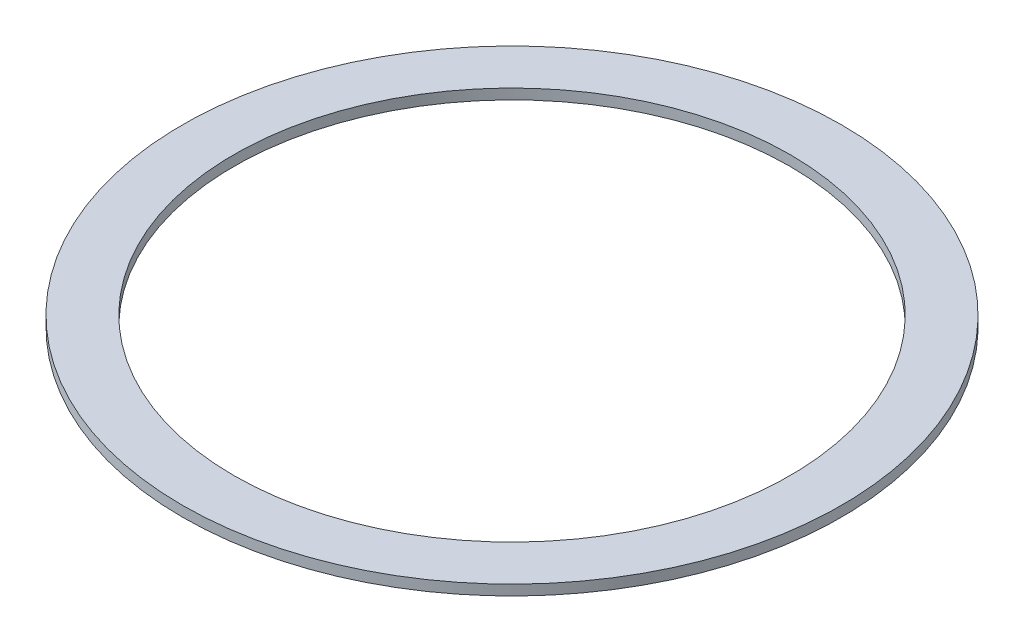
ISO-10303-21;
HEADER;
FILE_DESCRIPTION(('STEP AP214'),'2;1');
FILE_NAME('part.step','',(''),(''),'','','');
FILE_SCHEMA(('AUTOMOTIVE_DESIGN { 1 0 10303 214 1 1 1 1 }'));
ENDSEC;
DATA;
#1=APPLICATION_CONTEXT('core data for automotive mechanical design processes');
#2=APPLICATION_PROTOCOL_DEFINITION('international standard','automotive_design',2000,#1);
#3=PRODUCT_CONTEXT('',#1,'mechanical');
#4=PRODUCT('Part','Part','',(#3));
#5=PRODUCT_RELATED_PRODUCT_CATEGORY('part','',(#4));
#6=PRODUCT_DEFINITION_FORMATION('','',#4);
#7=PRODUCT_DEFINITION_CONTEXT('part definition',#1,'design');
#8=PRODUCT_DEFINITION('design','',#6,#7);
#9=PRODUCT_DEFINITION_SHAPE('','',#8);
#10=(LENGTH_UNIT() NAMED_UNIT(*) SI_UNIT(.MILLI.,.METRE.));
#11=(NAMED_UNIT(*) PLANE_ANGLE_UNIT() SI_UNIT($,.RADIAN.));
#12=(NAMED_UNIT(*) SI_UNIT($,.STERADIAN.) SOLID_ANGLE_UNIT());
#13=UNCERTAINTY_MEASURE_WITH_UNIT(LENGTH_MEASURE(1.E-05),#10,'distance_accuracy_value','');
#14=(GEOMETRIC_REPRESENTATION_CONTEXT(3) GLOBAL_UNCERTAINTY_ASSIGNED_CONTEXT((#13)) GLOBAL_UNIT_ASSIGNED_CONTEXT((#10,
#11,#12)) REPRESENTATION_CONTEXT('',''));
#15=CARTESIAN_POINT('',(0.,0.,0.));
#16=DIRECTION('',(0.,0.,1.));
#17=DIRECTION('',(1.,0.,0.));
#18=AXIS2_PLACEMENT_3D('',#15,#16,#17);
#19=CARTESIAN_POINT('',(0.,1.5,0.));
#20=DIRECTION('',(0.,1.,0.));
#21=DIRECTION('',(0.,0.,1.));
#22=AXIS2_PLACEMENT_3D('',#19,#20,#21);
#23=PLANE('',#22);
#24=CARTESIAN_POINT('',(0.,1.5,0.));
#25=DIRECTION('',(0.,1.,0.));
#26=DIRECTION('',(0.,0.,1.));
#27=AXIS2_PLACEMENT_3D('',#24,#25,#26);
#28=CIRCLE('',#27,48.);
#29=CARTESIAN_POINT('',(0.,1.5,48.));
#30=VERTEX_POINT('',#29);
#31=EDGE_CURVE('E10',#30,#30,#28,.T.);
#32=ORIENTED_EDGE('',*,*,#31,.T.);
#33=EDGE_LOOP('',(#32));
#34=FACE_BOUND('',#33,.T.);
#35=CARTESIAN_POINT('',(0.,1.5,0.));
#36=DIRECTION('',(0.,1.,0.));
#37=DIRECTION('',(0.,0.,1.));
#38=AXIS2_PLACEMENT_3D('',#35,#36,#37);
#39=CIRCLE('',#38,40.5);
#40=CARTESIAN_POINT('',(0.,1.5,40.5));
#41=VERTEX_POINT('',#40);
#42=EDGE_CURVE('E41',#41,#41,#39,.T.);
#43=ORIENTED_EDGE('',*,*,#42,.F.);
#44=EDGE_LOOP('',(#43));
#45=FACE_BOUND('',#44,.T.);
#46=ADVANCED_FACE('F30',(#34,#45),#23,.T.);
#47=CARTESIAN_POINT('',(0.,0.,0.));
#48=DIRECTION('',(0.,1.,0.));
#49=DIRECTION('',(0.,0.,1.));
#50=AXIS2_PLACEMENT_3D('',#47,#48,#49);
#51=PLANE('',#50);
#52=CARTESIAN_POINT('',(0.,0.,0.));
#53=DIRECTION('',(0.,1.,0.));
#54=DIRECTION('',(0.,0.,1.));
#55=AXIS2_PLACEMENT_3D('',#52,#53,#54);
#56=CIRCLE('',#55,48.);
#57=CARTESIAN_POINT('',(0.,0.,48.));
#58=VERTEX_POINT('',#57);
#59=EDGE_CURVE('E34',#58,#58,#56,.T.);
#60=ORIENTED_EDGE('',*,*,#59,.F.);
#61=EDGE_LOOP('',(#60));
#62=FACE_BOUND('',#61,.T.);
#63=CARTESIAN_POINT('',(0.,0.,0.));
#64=DIRECTION('',(0.,1.,0.));
#65=DIRECTION('',(0.,0.,1.));
#66=AXIS2_PLACEMENT_3D('',#63,#64,#65);
#67=CIRCLE('',#66,40.5);
#68=CARTESIAN_POINT('',(0.,0.,40.5));
#69=VERTEX_POINT('',#68);
#70=EDGE_CURVE('E43',#69,#69,#67,.T.);
#71=ORIENTED_EDGE('',*,*,#70,.T.);
#72=EDGE_LOOP('',(#71));
#73=FACE_BOUND('',#72,.T.);
#74=ADVANCED_FACE('F53',(#62,#73),#51,.F.);
#75=CARTESIAN_POINT('',(0.,1.5,0.));
#76=DIRECTION('',(0.,-1.,0.));
#77=DIRECTION('',(0.,0.,-1.));
#78=AXIS2_PLACEMENT_3D('',#75,#76,#77);
#79=CYLINDRICAL_SURFACE('',#78,48.);
#80=ORIENTED_EDGE('',*,*,#31,.F.);
#81=EDGE_LOOP('',(#80));
#82=FACE_BOUND('',#81,.T.);
#83=ORIENTED_EDGE('',*,*,#59,.T.);
#84=EDGE_LOOP('',(#83));
#85=FACE_BOUND('',#84,.T.);
#86=ADVANCED_FACE('F32',(#82,#85),#79,.T.);
#87=CARTESIAN_POINT('',(0.,1.5,0.));
#88=DIRECTION('',(0.,-1.,0.));
#89=DIRECTION('',(0.,0.,-1.));
#90=AXIS2_PLACEMENT_3D('',#87,#88,#89);
#91=CYLINDRICAL_SURFACE('',#90,40.5);
#92=ORIENTED_EDGE('',*,*,#42,.T.);
#93=EDGE_LOOP('',(#92));
#94=FACE_BOUND('',#93,.T.);
#95=ORIENTED_EDGE('',*,*,#70,.F.);
#96=EDGE_LOOP('',(#95));
#97=FACE_BOUND('',#96,.T.);
#98=ADVANCED_FACE('F49',(#94,#97),#91,.F.);
#99=CLOSED_SHELL('',(#46,#74,#86,#98));
#100=MANIFOLD_SOLID_BREP('B2',#99);
#101=ADVANCED_BREP_SHAPE_REPRESENTATION('',(#18,#100),#14);
#102=SHAPE_DEFINITION_REPRESENTATION(#9,#101);
ENDSEC;
END-ISO-10303-21;
